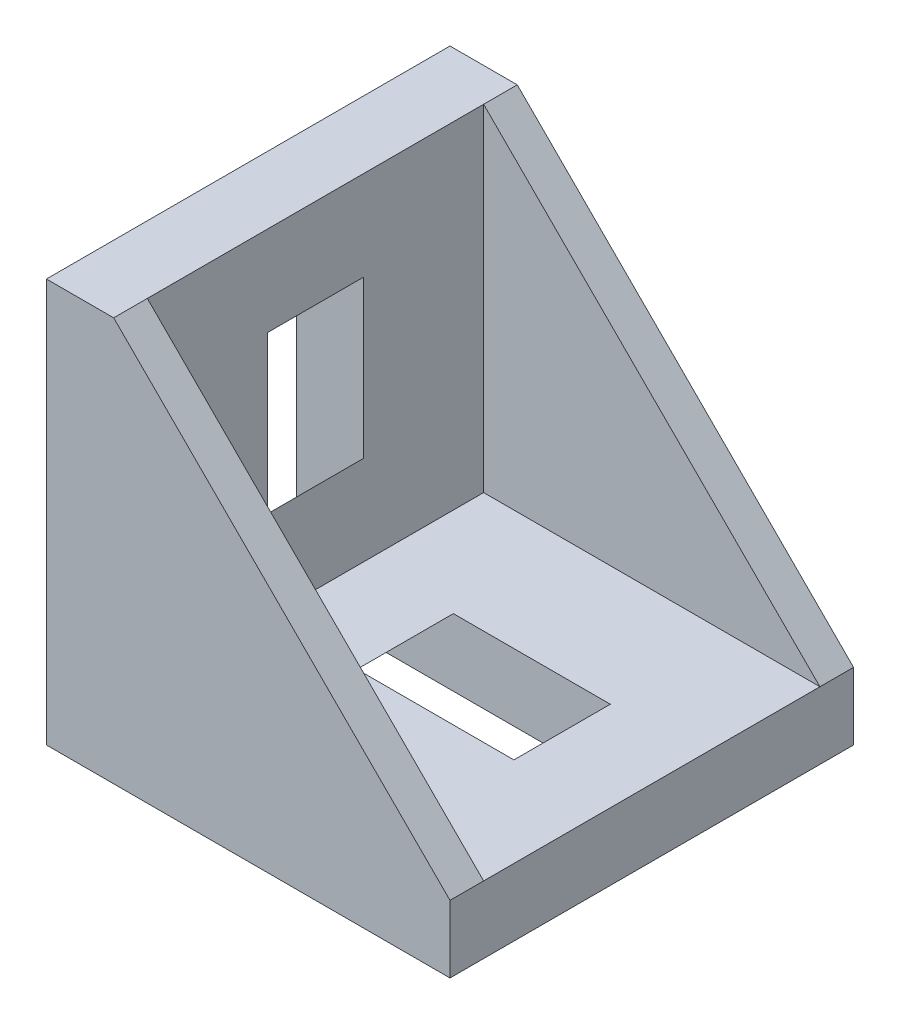
ISO-10303-21;
HEADER;
FILE_DESCRIPTION(('STEP AP214'),'2;1');
FILE_NAME('part.step','',(''),(''),'','','');
FILE_SCHEMA(('AUTOMOTIVE_DESIGN { 1 0 10303 214 1 1 1 1 }'));
ENDSEC;
DATA;
#1=APPLICATION_CONTEXT('core data for automotive mechanical design processes');
#2=APPLICATION_PROTOCOL_DEFINITION('international standard','automotive_design',2000,#1);
#3=PRODUCT_CONTEXT('',#1,'mechanical');
#4=PRODUCT('Part','Part','',(#3));
#5=PRODUCT_RELATED_PRODUCT_CATEGORY('part','',(#4));
#6=PRODUCT_DEFINITION_FORMATION('','',#4);
#7=PRODUCT_DEFINITION_CONTEXT('part definition',#1,'design');
#8=PRODUCT_DEFINITION('design','',#6,#7);
#9=PRODUCT_DEFINITION_SHAPE('','',#8);
#10=(LENGTH_UNIT() NAMED_UNIT(*) SI_UNIT(.MILLI.,.METRE.));
#11=(NAMED_UNIT(*) PLANE_ANGLE_UNIT() SI_UNIT($,.RADIAN.));
#12=(NAMED_UNIT(*) SI_UNIT($,.STERADIAN.) SOLID_ANGLE_UNIT());
#13=UNCERTAINTY_MEASURE_WITH_UNIT(LENGTH_MEASURE(1.E-05),#10,'distance_accuracy_value','');
#14=(GEOMETRIC_REPRESENTATION_CONTEXT(3) GLOBAL_UNCERTAINTY_ASSIGNED_CONTEXT((#13)) GLOBAL_UNIT_ASSIGNED_CONTEXT((#10,
#11,#12)) REPRESENTATION_CONTEXT('',''));
#15=CARTESIAN_POINT('',(0.,0.,0.));
#16=DIRECTION('',(0.,0.,1.));
#17=DIRECTION('',(1.,0.,0.));
#18=AXIS2_PLACEMENT_3D('',#15,#16,#17);
#19=CARTESIAN_POINT('',(0.,0.,9.));
#20=DIRECTION('',(1.,0.,0.));
#21=DIRECTION('',(0.,0.,-1.));
#22=AXIS2_PLACEMENT_3D('',#19,#20,#21);
#23=PLANE('',#22);
#24=DIRECTION('',(0.,0.,-1.));
#25=VECTOR('',#24,1.);
#26=CARTESIAN_POINT('',(0.,17.3,2.5));
#27=LINE('',#26,#25);
#28=CARTESIAN_POINT('',(0.,17.3,2.5));
#29=VERTEX_POINT('',#28);
#30=CARTESIAN_POINT('',(0.,17.3,-2.5));
#31=VERTEX_POINT('',#30);
#32=EDGE_CURVE('E290',#29,#31,#27,.T.);
#33=ORIENTED_EDGE('',*,*,#32,.F.);
#34=DIRECTION('',(0.,1.,0.));
#35=VECTOR('',#34,1.);
#36=CARTESIAN_POINT('',(0.,17.3,2.5));
#37=LINE('',#36,#35);
#38=CARTESIAN_POINT('',(0.,14.9992165715514,2.5));
#39=VERTEX_POINT('',#38);
#40=EDGE_CURVE('E287',#39,#29,#37,.T.);
#41=ORIENTED_EDGE('',*,*,#40,.F.);
#42=DIRECTION('',(0.,0.,-1.));
#43=VECTOR('',#42,1.);
#44=CARTESIAN_POINT('',(0.,14.9992165715514,2.5));
#45=LINE('',#44,#43);
#46=CARTESIAN_POINT('',(0.,14.9992165715514,-2.5));
#47=VERTEX_POINT('',#46);
#48=EDGE_CURVE('E301',#39,#47,#45,.T.);
#49=ORIENTED_EDGE('',*,*,#48,.T.);
#50=DIRECTION('',(0.,1.,0.));
#51=VECTOR('',#50,1.);
#52=CARTESIAN_POINT('',(0.,17.3,-2.5));
#53=LINE('',#52,#51);
#54=EDGE_CURVE('E282',#47,#31,#53,.T.);
#55=ORIENTED_EDGE('',*,*,#54,.T.);
#56=EDGE_LOOP('',(#33,#41,#49,#55));
#57=FACE_BOUND('',#56,.T.);
#58=DIRECTION('',(0.,-1.,0.));
#59=VECTOR('',#58,1.);
#60=CARTESIAN_POINT('',(0.,14.,-2.15));
#61=LINE('',#60,#59);
#62=CARTESIAN_POINT('',(0.,14.,-2.15));
#63=VERTEX_POINT('',#62);
#64=CARTESIAN_POINT('',(0.,4.,-2.15));
#65=VERTEX_POINT('',#64);
#66=EDGE_CURVE('E404',#63,#65,#61,.T.);
#67=ORIENTED_EDGE('',*,*,#66,.F.);
#68=DIRECTION('',(0.,0.,1.));
#69=VECTOR('',#68,1.);
#70=CARTESIAN_POINT('',(0.,14.,-2.15));
#71=LINE('',#70,#69);
#72=CARTESIAN_POINT('',(0.,14.,2.15));
#73=VERTEX_POINT('',#72);
#74=EDGE_CURVE('E427',#63,#73,#71,.T.);
#75=ORIENTED_EDGE('',*,*,#74,.T.);
#76=DIRECTION('',(0.,-1.,0.));
#77=VECTOR('',#76,1.);
#78=CARTESIAN_POINT('',(0.,14.,2.15));
#79=LINE('',#78,#77);
#80=CARTESIAN_POINT('',(0.,4.,2.15));
#81=VERTEX_POINT('',#80);
#82=EDGE_CURVE('E395',#73,#81,#79,.T.);
#83=ORIENTED_EDGE('',*,*,#82,.T.);
#84=DIRECTION('',(0.,0.,1.));
#85=VECTOR('',#84,1.);
#86=CARTESIAN_POINT('',(0.,4.,-2.15));
#87=LINE('',#86,#85);
#88=EDGE_CURVE('E416',#65,#81,#87,.T.);
#89=ORIENTED_EDGE('',*,*,#88,.F.);
#90=EDGE_LOOP('',(#67,#75,#83,#89));
#91=FACE_BOUND('',#90,.T.);
#92=DIRECTION('',(0.,-1.,0.));
#93=VECTOR('',#92,1.);
#94=CARTESIAN_POINT('',(0.,0.,-9.));
#95=LINE('',#94,#93);
#96=CARTESIAN_POINT('',(0.,18.,-9.));
#97=VERTEX_POINT('',#96);
#98=CARTESIAN_POINT('',(0.,0.,-9.));
#99=VERTEX_POINT('',#98);
#100=EDGE_CURVE('E467',#97,#99,#95,.T.);
#101=ORIENTED_EDGE('',*,*,#100,.T.);
#102=DIRECTION('',(0.,0.,-1.));
#103=VECTOR('',#102,1.);
#104=CARTESIAN_POINT('',(0.,0.,9.));
#105=LINE('',#104,#103);
#106=CARTESIAN_POINT('',(0.,0.,9.));
#107=VERTEX_POINT('',#106);
#108=EDGE_CURVE('E475',#107,#99,#105,.T.);
#109=ORIENTED_EDGE('',*,*,#108,.F.);
#110=DIRECTION('',(0.,-1.,0.));
#111=VECTOR('',#110,1.);
#112=CARTESIAN_POINT('',(0.,0.,9.));
#113=LINE('',#112,#111);
#114=CARTESIAN_POINT('',(0.,18.,9.));
#115=VERTEX_POINT('',#114);
#116=EDGE_CURVE('E473',#115,#107,#113,.T.);
#117=ORIENTED_EDGE('',*,*,#116,.F.);
#118=DIRECTION('',(0.,0.,-1.));
#119=VECTOR('',#118,1.);
#120=CARTESIAN_POINT('',(0.,18.,9.));
#121=LINE('',#120,#119);
#122=EDGE_CURVE('E489',#115,#97,#121,.T.);
#123=ORIENTED_EDGE('',*,*,#122,.T.);
#124=EDGE_LOOP('',(#101,#109,#117,#123));
#125=FACE_BOUND('',#124,.T.);
#126=DIRECTION('',(0.,1.,0.));
#127=VECTOR('',#126,1.);
#128=CARTESIAN_POINT('',(0.,1.23475047748417,2.5));
#129=LINE('',#128,#127);
#130=CARTESIAN_POINT('',(0.,1.23475047748417,2.5));
#131=VERTEX_POINT('',#130);
#132=CARTESIAN_POINT('',(0.,3.53553390593273,2.5));
#133=VERTEX_POINT('',#132);
#134=EDGE_CURVE('E310',#131,#133,#129,.T.);
#135=ORIENTED_EDGE('',*,*,#134,.F.);
#136=DIRECTION('',(0.,0.,-1.));
#137=VECTOR('',#136,1.);
#138=CARTESIAN_POINT('',(0.,1.23475047748417,2.5));
#139=LINE('',#138,#137);
#140=CARTESIAN_POINT('',(0.,1.23475047748417,-2.5));
#141=VERTEX_POINT('',#140);
#142=EDGE_CURVE('E320',#131,#141,#139,.T.);
#143=ORIENTED_EDGE('',*,*,#142,.T.);
#144=DIRECTION('',(0.,1.,0.));
#145=VECTOR('',#144,1.);
#146=CARTESIAN_POINT('',(0.,1.23475047748417,-2.5));
#147=LINE('',#146,#145);
#148=CARTESIAN_POINT('',(0.,3.53553390593273,-2.5));
#149=VERTEX_POINT('',#148);
#150=EDGE_CURVE('E309',#141,#149,#147,.T.);
#151=ORIENTED_EDGE('',*,*,#150,.T.);
#152=DIRECTION('',(0.,0.,-1.));
#153=VECTOR('',#152,1.);
#154=CARTESIAN_POINT('',(0.,3.53553390593273,2.5));
#155=LINE('',#154,#153);
#156=EDGE_CURVE('E336',#133,#149,#155,.T.);
#157=ORIENTED_EDGE('',*,*,#156,.F.);
#158=EDGE_LOOP('',(#135,#143,#151,#157));
#159=FACE_BOUND('',#158,.T.);
#160=ADVANCED_FACE('F34',(#57,#91,#125,#159),#23,.F.);
#161=CARTESIAN_POINT('',(18.,0.,9.));
#162=DIRECTION('',(0.,1.,0.));
#163=DIRECTION('',(-1.,0.,0.));
#164=AXIS2_PLACEMENT_3D('',#161,#162,#163);
#165=PLANE('',#164);
#166=DIRECTION('',(0.,0.,-1.));
#167=VECTOR('',#166,1.);
#168=CARTESIAN_POINT('',(14.9992165715514,0.,2.5));
#169=LINE('',#168,#167);
#170=CARTESIAN_POINT('',(14.9992165715514,0.,2.5));
#171=VERTEX_POINT('',#170);
#172=CARTESIAN_POINT('',(14.9992165715514,0.,-2.5));
#173=VERTEX_POINT('',#172);
#174=EDGE_CURVE('E49',#171,#173,#169,.T.);
#175=ORIENTED_EDGE('',*,*,#174,.F.);
#176=DIRECTION('',(-1.,0.,0.));
#177=VECTOR('',#176,1.);
#178=CARTESIAN_POINT('',(17.3,0.,2.5));
#179=LINE('',#178,#177);
#180=CARTESIAN_POINT('',(17.3,0.,2.5));
#181=VERTEX_POINT('',#180);
#182=EDGE_CURVE('E54',#181,#171,#179,.T.);
#183=ORIENTED_EDGE('',*,*,#182,.F.);
#184=DIRECTION('',(0.,0.,-1.));
#185=VECTOR('',#184,1.);
#186=CARTESIAN_POINT('',(17.3,0.,2.5));
#187=LINE('',#186,#185);
#188=CARTESIAN_POINT('',(17.3,0.,-2.5));
#189=VERTEX_POINT('',#188);
#190=EDGE_CURVE('E262',#181,#189,#187,.T.);
#191=ORIENTED_EDGE('',*,*,#190,.T.);
#192=DIRECTION('',(-1.,0.,0.));
#193=VECTOR('',#192,1.);
#194=CARTESIAN_POINT('',(17.3,0.,-2.5));
#195=LINE('',#194,#193);
#196=EDGE_CURVE('E266',#189,#173,#195,.T.);
#197=ORIENTED_EDGE('',*,*,#196,.T.);
#198=EDGE_LOOP('',(#175,#183,#191,#197));
#199=FACE_BOUND('',#198,.T.);
#200=DIRECTION('',(1.,0.,0.));
#201=VECTOR('',#200,1.);
#202=CARTESIAN_POINT('',(4.,0.,-2.15));
#203=LINE('',#202,#201);
#204=CARTESIAN_POINT('',(4.,0.,-2.15));
#205=VERTEX_POINT('',#204);
#206=CARTESIAN_POINT('',(14.,0.,-2.15));
#207=VERTEX_POINT('',#206);
#208=EDGE_CURVE('E372',#205,#207,#203,.T.);
#209=ORIENTED_EDGE('',*,*,#208,.F.);
#210=DIRECTION('',(0.,0.,1.));
#211=VECTOR('',#210,1.);
#212=CARTESIAN_POINT('',(4.,0.,-2.15));
#213=LINE('',#212,#211);
#214=CARTESIAN_POINT('',(4.,0.,2.15));
#215=VERTEX_POINT('',#214);
#216=EDGE_CURVE('E382',#205,#215,#213,.T.);
#217=ORIENTED_EDGE('',*,*,#216,.T.);
#218=DIRECTION('',(1.,0.,0.));
#219=VECTOR('',#218,1.);
#220=CARTESIAN_POINT('',(4.,0.,2.15));
#221=LINE('',#220,#219);
#222=CARTESIAN_POINT('',(14.,0.,2.15));
#223=VERTEX_POINT('',#222);
#224=EDGE_CURVE('E385',#215,#223,#221,.T.);
#225=ORIENTED_EDGE('',*,*,#224,.T.);
#226=DIRECTION('',(0.,0.,1.));
#227=VECTOR('',#226,1.);
#228=CARTESIAN_POINT('',(14.,0.,-2.15));
#229=LINE('',#228,#227);
#230=EDGE_CURVE('E399',#207,#223,#229,.T.);
#231=ORIENTED_EDGE('',*,*,#230,.F.);
#232=EDGE_LOOP('',(#209,#217,#225,#231));
#233=FACE_BOUND('',#232,.T.);
#234=DIRECTION('',(1.,0.,0.));
#235=VECTOR('',#234,1.);
#236=CARTESIAN_POINT('',(18.,0.,-9.));
#237=LINE('',#236,#235);
#238=CARTESIAN_POINT('',(18.,0.,-9.));
#239=VERTEX_POINT('',#238);
#240=EDGE_CURVE('E459',#99,#239,#237,.T.);
#241=ORIENTED_EDGE('',*,*,#240,.T.);
#242=DIRECTION('',(0.,0.,-1.));
#243=VECTOR('',#242,1.);
#244=CARTESIAN_POINT('',(18.,0.,9.));
#245=LINE('',#244,#243);
#246=CARTESIAN_POINT('',(18.,0.,9.));
#247=VERTEX_POINT('',#246);
#248=EDGE_CURVE('E11',#247,#239,#245,.T.);
#249=ORIENTED_EDGE('',*,*,#248,.F.);
#250=DIRECTION('',(1.,0.,0.));
#251=VECTOR('',#250,1.);
#252=CARTESIAN_POINT('',(18.,0.,9.));
#253=LINE('',#252,#251);
#254=EDGE_CURVE('E463',#107,#247,#253,.T.);
#255=ORIENTED_EDGE('',*,*,#254,.F.);
#256=ORIENTED_EDGE('',*,*,#108,.T.);
#257=EDGE_LOOP('',(#241,#249,#255,#256));
#258=FACE_BOUND('',#257,.T.);
#259=DIRECTION('',(-1.,0.,0.));
#260=VECTOR('',#259,1.);
#261=CARTESIAN_POINT('',(1.23475047748409,0.,2.5));
#262=LINE('',#261,#260);
#263=CARTESIAN_POINT('',(3.53553390593274,0.,2.5));
#264=VERTEX_POINT('',#263);
#265=CARTESIAN_POINT('',(1.23475047748409,0.,2.5));
#266=VERTEX_POINT('',#265);
#267=EDGE_CURVE('E341',#264,#266,#262,.T.);
#268=ORIENTED_EDGE('',*,*,#267,.F.);
#269=DIRECTION('',(0.,0.,-1.));
#270=VECTOR('',#269,1.);
#271=CARTESIAN_POINT('',(3.53553390593274,0.,2.5));
#272=LINE('',#271,#270);
#273=CARTESIAN_POINT('',(3.53553390593274,0.,-2.5));
#274=VERTEX_POINT('',#273);
#275=EDGE_CURVE('E365',#264,#274,#272,.T.);
#276=ORIENTED_EDGE('',*,*,#275,.T.);
#277=DIRECTION('',(-1.,0.,0.));
#278=VECTOR('',#277,1.);
#279=CARTESIAN_POINT('',(1.23475047748409,0.,-2.5));
#280=LINE('',#279,#278);
#281=CARTESIAN_POINT('',(1.23475047748409,0.,-2.5));
#282=VERTEX_POINT('',#281);
#283=EDGE_CURVE('E351',#274,#282,#280,.T.);
#284=ORIENTED_EDGE('',*,*,#283,.T.);
#285=DIRECTION('',(0.,0.,-1.));
#286=VECTOR('',#285,1.);
#287=CARTESIAN_POINT('',(1.23475047748409,0.,2.5));
#288=LINE('',#287,#286);
#289=EDGE_CURVE('E362',#266,#282,#288,.T.);
#290=ORIENTED_EDGE('',*,*,#289,.F.);
#291=EDGE_LOOP('',(#268,#276,#284,#290));
#292=FACE_BOUND('',#291,.T.);
#293=ADVANCED_FACE('F36',(#199,#233,#258,#292),#165,.F.);
#294=CARTESIAN_POINT('',(3.,3.,-7.5));
#295=DIRECTION('',(0.,-1.,0.));
#296=DIRECTION('',(0.,0.,-1.));
#297=AXIS2_PLACEMENT_3D('',#294,#295,#296);
#298=PLANE('',#297);
#299=DIRECTION('',(1.,0.,0.));
#300=VECTOR('',#299,1.);
#301=CARTESIAN_POINT('',(3.,3.,7.5));
#302=LINE('',#301,#300);
#303=CARTESIAN_POINT('',(3.,3.,7.5));
#304=VERTEX_POINT('',#303);
#305=CARTESIAN_POINT('',(18.,3.,7.5));
#306=VERTEX_POINT('',#305);
#307=EDGE_CURVE('E442',#304,#306,#302,.T.);
#308=ORIENTED_EDGE('',*,*,#307,.T.);
#309=DIRECTION('',(0.,0.,1.));
#310=VECTOR('',#309,1.);
#311=CARTESIAN_POINT('',(18.,3.,-7.5));
#312=LINE('',#311,#310);
#313=CARTESIAN_POINT('',(18.,3.,-7.5));
#314=VERTEX_POINT('',#313);
#315=EDGE_CURVE('E456',#314,#306,#312,.T.);
#316=ORIENTED_EDGE('',*,*,#315,.F.);
#317=DIRECTION('',(1.,0.,0.));
#318=VECTOR('',#317,1.);
#319=CARTESIAN_POINT('',(3.,3.,-7.5));
#320=LINE('',#319,#318);
#321=CARTESIAN_POINT('',(3.,3.,-7.5));
#322=VERTEX_POINT('',#321);
#323=EDGE_CURVE('E445',#322,#314,#320,.T.);
#324=ORIENTED_EDGE('',*,*,#323,.F.);
#325=DIRECTION('',(0.,0.,1.));
#326=VECTOR('',#325,1.);
#327=CARTESIAN_POINT('',(3.,3.,-7.5));
#328=LINE('',#327,#326);
#329=EDGE_CURVE('E460',#322,#304,#328,.T.);
#330=ORIENTED_EDGE('',*,*,#329,.T.);
#331=EDGE_LOOP('',(#308,#316,#324,#330));
#332=FACE_BOUND('',#331,.T.);
#333=DIRECTION('',(-1.,0.,0.));
#334=VECTOR('',#333,1.);
#335=CARTESIAN_POINT('',(7.,3.,-2.15));
#336=LINE('',#335,#334);
#337=CARTESIAN_POINT('',(14.,3.,-2.15));
#338=VERTEX_POINT('',#337);
#339=CARTESIAN_POINT('',(7.,3.,-2.15));
#340=VERTEX_POINT('',#339);
#341=EDGE_CURVE('E379',#338,#340,#336,.T.);
#342=ORIENTED_EDGE('',*,*,#341,.F.);
#343=DIRECTION('',(0.,0.,1.));
#344=VECTOR('',#343,1.);
#345=CARTESIAN_POINT('',(14.,3.,-2.15));
#346=LINE('',#345,#344);
#347=CARTESIAN_POINT('',(14.,3.,2.15));
#348=VERTEX_POINT('',#347);
#349=EDGE_CURVE('E396',#338,#348,#346,.T.);
#350=ORIENTED_EDGE('',*,*,#349,.T.);
#351=DIRECTION('',(-1.,0.,0.));
#352=VECTOR('',#351,1.);
#353=CARTESIAN_POINT('',(7.,3.,2.15));
#354=LINE('',#353,#352);
#355=CARTESIAN_POINT('',(7.,3.,2.15));
#356=VERTEX_POINT('',#355);
#357=EDGE_CURVE('E373',#348,#356,#354,.T.);
#358=ORIENTED_EDGE('',*,*,#357,.T.);
#359=DIRECTION('',(0.,0.,1.));
#360=VECTOR('',#359,1.);
#361=CARTESIAN_POINT('',(7.,3.,-2.15));
#362=LINE('',#361,#360);
#363=EDGE_CURVE('E392',#340,#356,#362,.T.);
#364=ORIENTED_EDGE('',*,*,#363,.F.);
#365=EDGE_LOOP('',(#342,#350,#358,#364));
#366=FACE_BOUND('',#365,.T.);
#367=ADVANCED_FACE('F533',(#332,#366),#298,.F.);
#368=CARTESIAN_POINT('',(3.,18.,-7.5));
#369=DIRECTION('',(-1.,0.,0.));
#370=DIRECTION('',(0.,-1.,0.));
#371=AXIS2_PLACEMENT_3D('',#368,#369,#370);
#372=PLANE('',#371);
#373=DIRECTION('',(0.,-1.,0.));
#374=VECTOR('',#373,1.);
#375=CARTESIAN_POINT('',(3.,18.,7.5));
#376=LINE('',#375,#374);
#377=CARTESIAN_POINT('',(3.,18.,7.5));
#378=VERTEX_POINT('',#377);
#379=EDGE_CURVE('E451',#378,#304,#376,.T.);
#380=ORIENTED_EDGE('',*,*,#379,.T.);
#381=ORIENTED_EDGE('',*,*,#329,.F.);
#382=DIRECTION('',(0.,-1.,0.));
#383=VECTOR('',#382,1.);
#384=CARTESIAN_POINT('',(3.,18.,-7.5));
#385=LINE('',#384,#383);
#386=CARTESIAN_POINT('',(3.,18.,-7.5));
#387=VERTEX_POINT('',#386);
#388=EDGE_CURVE('E441',#387,#322,#385,.T.);
#389=ORIENTED_EDGE('',*,*,#388,.F.);
#390=DIRECTION('',(0.,0.,1.));
#391=VECTOR('',#390,1.);
#392=CARTESIAN_POINT('',(3.,18.,-7.5));
#393=LINE('',#392,#391);
#394=EDGE_CURVE('E448',#387,#378,#393,.T.);
#395=ORIENTED_EDGE('',*,*,#394,.T.);
#396=EDGE_LOOP('',(#380,#381,#389,#395));
#397=FACE_BOUND('',#396,.T.);
#398=DIRECTION('',(0.,1.,0.));
#399=VECTOR('',#398,1.);
#400=CARTESIAN_POINT('',(3.,14.,-2.15));
#401=LINE('',#400,#399);
#402=CARTESIAN_POINT('',(3.,7.,-2.15));
#403=VERTEX_POINT('',#402);
#404=CARTESIAN_POINT('',(3.,14.,-2.15));
#405=VERTEX_POINT('',#404);
#406=EDGE_CURVE('E411',#403,#405,#401,.T.);
#407=ORIENTED_EDGE('',*,*,#406,.F.);
#408=DIRECTION('',(0.,0.,1.));
#409=VECTOR('',#408,1.);
#410=CARTESIAN_POINT('',(3.,7.,-2.15));
#411=LINE('',#410,#409);
#412=CARTESIAN_POINT('',(3.,7.,2.15));
#413=VERTEX_POINT('',#412);
#414=EDGE_CURVE('E434',#403,#413,#411,.T.);
#415=ORIENTED_EDGE('',*,*,#414,.T.);
#416=DIRECTION('',(0.,1.,0.));
#417=VECTOR('',#416,1.);
#418=CARTESIAN_POINT('',(3.,14.,2.15));
#419=LINE('',#418,#417);
#420=CARTESIAN_POINT('',(3.,14.,2.15));
#421=VERTEX_POINT('',#420);
#422=EDGE_CURVE('E422',#413,#421,#419,.T.);
#423=ORIENTED_EDGE('',*,*,#422,.T.);
#424=DIRECTION('',(0.,0.,1.));
#425=VECTOR('',#424,1.);
#426=CARTESIAN_POINT('',(3.,14.,-2.15));
#427=LINE('',#426,#425);
#428=EDGE_CURVE('E431',#405,#421,#427,.T.);
#429=ORIENTED_EDGE('',*,*,#428,.F.);
#430=EDGE_LOOP('',(#407,#415,#423,#429));
#431=FACE_BOUND('',#430,.T.);
#432=ADVANCED_FACE('F538',(#397,#431),#372,.F.);
#433=CARTESIAN_POINT('',(18.,3.,9.));
#434=DIRECTION('',(-0.707106781186547,-0.707106781186547,0.));
#435=DIRECTION('',(0.707106781186548,-0.707106781186548,0.));
#436=AXIS2_PLACEMENT_3D('',#433,#434,#435);
#437=PLANE('',#436);
#438=DIRECTION('',(-0.707106781186547,0.707106781186547,0.));
#439=VECTOR('',#438,1.);
#440=CARTESIAN_POINT('',(3.,18.,-7.5));
#441=LINE('',#440,#439);
#442=EDGE_CURVE('E439',#314,#387,#441,.T.);
#443=ORIENTED_EDGE('',*,*,#442,.F.);
#444=DIRECTION('',(0.,0.,-1.));
#445=VECTOR('',#444,1.);
#446=CARTESIAN_POINT('',(18.,3.,9.));
#447=LINE('',#446,#445);
#448=CARTESIAN_POINT('',(18.,3.,-9.));
#449=VERTEX_POINT('',#448);
#450=EDGE_CURVE('E495',#314,#449,#447,.T.);
#451=ORIENTED_EDGE('',*,*,#450,.T.);
#452=DIRECTION('',(-0.707106781186547,0.707106781186547,0.));
#453=VECTOR('',#452,1.);
#454=CARTESIAN_POINT('',(18.,3.,-9.));
#455=LINE('',#454,#453);
#456=CARTESIAN_POINT('',(3.,18.,-9.));
#457=VERTEX_POINT('',#456);
#458=EDGE_CURVE('E481',#449,#457,#455,.T.);
#459=ORIENTED_EDGE('',*,*,#458,.T.);
#460=DIRECTION('',(0.,0.,-1.));
#461=VECTOR('',#460,1.);
#462=CARTESIAN_POINT('',(3.,18.,9.));
#463=LINE('',#462,#461);
#464=EDGE_CURVE('E492',#387,#457,#463,.T.);
#465=ORIENTED_EDGE('',*,*,#464,.F.);
#466=EDGE_LOOP('',(#443,#451,#459,#465));
#467=FACE_BOUND('',#466,.T.);
#468=ADVANCED_FACE('F503',(#467),#437,.F.);
#469=CARTESIAN_POINT('',(18.,3.,9.));
#470=DIRECTION('',(-1.,0.,0.));
#471=DIRECTION('',(0.,0.,1.));
#472=AXIS2_PLACEMENT_3D('',#469,#470,#471);
#473=PLANE('',#472);
#474=DIRECTION('',(0.,1.,0.));
#475=VECTOR('',#474,1.);
#476=CARTESIAN_POINT('',(18.,3.,-9.));
#477=LINE('',#476,#475);
#478=EDGE_CURVE('E478',#239,#449,#477,.T.);
#479=ORIENTED_EDGE('',*,*,#478,.T.);
#480=ORIENTED_EDGE('',*,*,#450,.F.);
#481=ORIENTED_EDGE('',*,*,#315,.T.);
#482=CARTESIAN_POINT('',(18.,3.,9.));
#483=VERTEX_POINT('',#482);
#484=EDGE_CURVE('E42',#483,#306,#447,.T.);
#485=ORIENTED_EDGE('',*,*,#484,.F.);
#486=DIRECTION('',(0.,1.,0.));
#487=VECTOR('',#486,1.);
#488=CARTESIAN_POINT('',(18.,3.,9.));
#489=LINE('',#488,#487);
#490=EDGE_CURVE('E466',#247,#483,#489,.T.);
#491=ORIENTED_EDGE('',*,*,#490,.F.);
#492=ORIENTED_EDGE('',*,*,#248,.T.);
#493=EDGE_LOOP('',(#479,#480,#481,#485,#491,#492));
#494=FACE_BOUND('',#493,.T.);
#495=ADVANCED_FACE('F508',(#494),#473,.F.);
#496=ORIENTED_EDGE('',*,*,#484,.T.);
#497=DIRECTION('',(-0.707106781186547,0.707106781186547,0.));
#498=VECTOR('',#497,1.);
#499=CARTESIAN_POINT('',(3.,18.,7.5));
#500=LINE('',#499,#498);
#501=EDGE_CURVE('E430',#306,#378,#500,.T.);
#502=ORIENTED_EDGE('',*,*,#501,.T.);
#503=CARTESIAN_POINT('',(3.,18.,9.));
#504=VERTEX_POINT('',#503);
#505=EDGE_CURVE('E493',#504,#378,#463,.T.);
#506=ORIENTED_EDGE('',*,*,#505,.F.);
#507=DIRECTION('',(-0.707106781186547,0.707106781186547,0.));
#508=VECTOR('',#507,1.);
#509=CARTESIAN_POINT('',(18.,3.,9.));
#510=LINE('',#509,#508);
#511=EDGE_CURVE('E469',#483,#504,#510,.T.);
#512=ORIENTED_EDGE('',*,*,#511,.F.);
#513=EDGE_LOOP('',(#496,#502,#506,#512));
#514=FACE_BOUND('',#513,.T.);
#515=ADVANCED_FACE('F527',(#514),#437,.F.);
#516=CARTESIAN_POINT('',(3.,18.,9.));
#517=DIRECTION('',(0.,-1.,0.));
#518=DIRECTION('',(0.,0.,-1.));
#519=AXIS2_PLACEMENT_3D('',#516,#517,#518);
#520=PLANE('',#519);
#521=DIRECTION('',(-1.,0.,0.));
#522=VECTOR('',#521,1.);
#523=CARTESIAN_POINT('',(3.,18.,-9.));
#524=LINE('',#523,#522);
#525=EDGE_CURVE('E484',#457,#97,#524,.T.);
#526=ORIENTED_EDGE('',*,*,#525,.T.);
#527=ORIENTED_EDGE('',*,*,#122,.F.);
#528=DIRECTION('',(-1.,0.,0.));
#529=VECTOR('',#528,1.);
#530=CARTESIAN_POINT('',(3.,18.,9.));
#531=LINE('',#530,#529);
#532=EDGE_CURVE('E471',#504,#115,#531,.T.);
#533=ORIENTED_EDGE('',*,*,#532,.F.);
#534=ORIENTED_EDGE('',*,*,#505,.T.);
#535=ORIENTED_EDGE('',*,*,#394,.F.);
#536=ORIENTED_EDGE('',*,*,#464,.T.);
#537=EDGE_LOOP('',(#526,#527,#533,#534,#535,#536));
#538=FACE_BOUND('',#537,.T.);
#539=ADVANCED_FACE('F516',(#538),#520,.F.);
#540=CARTESIAN_POINT('',(0.,0.,9.));
#541=DIRECTION('',(0.,0.,-1.));
#542=DIRECTION('',(-1.,0.,0.));
#543=AXIS2_PLACEMENT_3D('',#540,#541,#542);
#544=PLANE('',#543);
#545=ORIENTED_EDGE('',*,*,#254,.T.);
#546=ORIENTED_EDGE('',*,*,#490,.T.);
#547=ORIENTED_EDGE('',*,*,#511,.T.);
#548=ORIENTED_EDGE('',*,*,#532,.T.);
#549=ORIENTED_EDGE('',*,*,#116,.T.);
#550=EDGE_LOOP('',(#545,#546,#547,#548,#549));
#551=FACE_BOUND('',#550,.T.);
#552=ADVANCED_FACE('F525',(#551),#544,.F.);
#553=CARTESIAN_POINT('',(0.,0.,-9.));
#554=DIRECTION('',(0.,0.,-1.));
#555=DIRECTION('',(-1.,0.,0.));
#556=AXIS2_PLACEMENT_3D('',#553,#554,#555);
#557=PLANE('',#556);
#558=ORIENTED_EDGE('',*,*,#240,.F.);
#559=ORIENTED_EDGE('',*,*,#100,.F.);
#560=ORIENTED_EDGE('',*,*,#525,.F.);
#561=ORIENTED_EDGE('',*,*,#458,.F.);
#562=ORIENTED_EDGE('',*,*,#478,.F.);
#563=EDGE_LOOP('',(#558,#559,#560,#561,#562));
#564=FACE_BOUND('',#563,.T.);
#565=ADVANCED_FACE('F512',(#564),#557,.T.);
#566=CARTESIAN_POINT('',(18.,3.,-7.5));
#567=DIRECTION('',(0.,0.,1.));
#568=DIRECTION('',(1.,0.,0.));
#569=AXIS2_PLACEMENT_3D('',#566,#567,#568);
#570=PLANE('',#569);
#571=ORIENTED_EDGE('',*,*,#442,.T.);
#572=ORIENTED_EDGE('',*,*,#388,.T.);
#573=ORIENTED_EDGE('',*,*,#323,.T.);
#574=EDGE_LOOP('',(#571,#572,#573));
#575=FACE_BOUND('',#574,.T.);
#576=ADVANCED_FACE('F541',(#575),#570,.T.);
#577=CARTESIAN_POINT('',(18.,3.,7.5));
#578=DIRECTION('',(0.,0.,1.));
#579=DIRECTION('',(1.,0.,0.));
#580=AXIS2_PLACEMENT_3D('',#577,#578,#579);
#581=PLANE('',#580);
#582=ORIENTED_EDGE('',*,*,#501,.F.);
#583=ORIENTED_EDGE('',*,*,#307,.F.);
#584=ORIENTED_EDGE('',*,*,#379,.F.);
#585=EDGE_LOOP('',(#582,#583,#584));
#586=FACE_BOUND('',#585,.T.);
#587=ADVANCED_FACE('F531',(#586),#581,.F.);
#588=CARTESIAN_POINT('',(0.,14.,-2.15));
#589=DIRECTION('',(0.,1.,0.));
#590=DIRECTION('',(0.,0.,1.));
#591=AXIS2_PLACEMENT_3D('',#588,#589,#590);
#592=PLANE('',#591);
#593=DIRECTION('',(-1.,0.,0.));
#594=VECTOR('',#593,1.);
#595=CARTESIAN_POINT('',(0.,14.,2.15));
#596=LINE('',#595,#594);
#597=EDGE_CURVE('E408',#421,#73,#596,.T.);
#598=ORIENTED_EDGE('',*,*,#597,.T.);
#599=ORIENTED_EDGE('',*,*,#74,.F.);
#600=DIRECTION('',(-1.,0.,0.));
#601=VECTOR('',#600,1.);
#602=CARTESIAN_POINT('',(0.,14.,-2.15));
#603=LINE('',#602,#601);
#604=EDGE_CURVE('E413',#405,#63,#603,.T.);
#605=ORIENTED_EDGE('',*,*,#604,.F.);
#606=ORIENTED_EDGE('',*,*,#428,.T.);
#607=EDGE_LOOP('',(#598,#599,#605,#606));
#608=FACE_BOUND('',#607,.T.);
#609=ADVANCED_FACE('F548',(#608),#592,.F.);
#610=CARTESIAN_POINT('',(0.,4.,-2.15));
#611=DIRECTION('',(0.707106781186548,-0.707106781186547,0.));
#612=DIRECTION('',(0.707106781186547,0.707106781186548,0.));
#613=AXIS2_PLACEMENT_3D('',#610,#611,#612);
#614=PLANE('',#613);
#615=DIRECTION('',(0.707106781186547,0.707106781186548,0.));
#616=VECTOR('',#615,1.);
#617=CARTESIAN_POINT('',(0.,4.,2.15));
#618=LINE('',#617,#616);
#619=EDGE_CURVE('E419',#81,#413,#618,.T.);
#620=ORIENTED_EDGE('',*,*,#619,.T.);
#621=ORIENTED_EDGE('',*,*,#414,.F.);
#622=DIRECTION('',(0.707106781186547,0.707106781186548,0.));
#623=VECTOR('',#622,1.);
#624=CARTESIAN_POINT('',(0.,4.,-2.15));
#625=LINE('',#624,#623);
#626=EDGE_CURVE('E407',#65,#403,#625,.T.);
#627=ORIENTED_EDGE('',*,*,#626,.F.);
#628=ORIENTED_EDGE('',*,*,#88,.T.);
#629=EDGE_LOOP('',(#620,#621,#627,#628));
#630=FACE_BOUND('',#629,.T.);
#631=ADVANCED_FACE('F632',(#630),#614,.F.);
#632=CARTESIAN_POINT('',(0.,14.,-2.15));
#633=DIRECTION('',(0.,0.,1.));
#634=DIRECTION('',(1.,0.,0.));
#635=AXIS2_PLACEMENT_3D('',#632,#633,#634);
#636=PLANE('',#635);
#637=ORIENTED_EDGE('',*,*,#66,.T.);
#638=ORIENTED_EDGE('',*,*,#626,.T.);
#639=ORIENTED_EDGE('',*,*,#406,.T.);
#640=ORIENTED_EDGE('',*,*,#604,.T.);
#641=EDGE_LOOP('',(#637,#638,#639,#640));
#642=FACE_BOUND('',#641,.T.);
#643=ADVANCED_FACE('F642',(#642),#636,.T.);
#644=CARTESIAN_POINT('',(0.,14.,2.15));
#645=DIRECTION('',(0.,0.,1.));
#646=DIRECTION('',(1.,0.,0.));
#647=AXIS2_PLACEMENT_3D('',#644,#645,#646);
#648=PLANE('',#647);
#649=ORIENTED_EDGE('',*,*,#82,.F.);
#650=ORIENTED_EDGE('',*,*,#597,.F.);
#651=ORIENTED_EDGE('',*,*,#422,.F.);
#652=ORIENTED_EDGE('',*,*,#619,.F.);
#653=EDGE_LOOP('',(#649,#650,#651,#652));
#654=FACE_BOUND('',#653,.T.);
#655=ADVANCED_FACE('F651',(#654),#648,.F.);
#656=CARTESIAN_POINT('',(7.,3.,-2.15));
#657=DIRECTION('',(-0.707106781186548,0.707106781186547,0.));
#658=DIRECTION('',(-0.707106781186547,-0.707106781186548,0.));
#659=AXIS2_PLACEMENT_3D('',#656,#657,#658);
#660=PLANE('',#659);
#661=DIRECTION('',(-0.707106781186547,-0.707106781186548,0.));
#662=VECTOR('',#661,1.);
#663=CARTESIAN_POINT('',(7.,3.,2.15));
#664=LINE('',#663,#662);
#665=EDGE_CURVE('E368',#356,#215,#664,.T.);
#666=ORIENTED_EDGE('',*,*,#665,.T.);
#667=ORIENTED_EDGE('',*,*,#216,.F.);
#668=DIRECTION('',(-0.707106781186547,-0.707106781186548,0.));
#669=VECTOR('',#668,1.);
#670=CARTESIAN_POINT('',(7.,3.,-2.15));
#671=LINE('',#670,#669);
#672=EDGE_CURVE('E369',#340,#205,#671,.T.);
#673=ORIENTED_EDGE('',*,*,#672,.F.);
#674=ORIENTED_EDGE('',*,*,#363,.T.);
#675=EDGE_LOOP('',(#666,#667,#673,#674));
#676=FACE_BOUND('',#675,.T.);
#677=ADVANCED_FACE('F661',(#676),#660,.F.);
#678=CARTESIAN_POINT('',(14.,3.,-2.15));
#679=DIRECTION('',(1.,0.,0.));
#680=DIRECTION('',(0.,0.,-1.));
#681=AXIS2_PLACEMENT_3D('',#678,#679,#680);
#682=PLANE('',#681);
#683=DIRECTION('',(0.,1.,0.));
#684=VECTOR('',#683,1.);
#685=CARTESIAN_POINT('',(14.,3.,2.15));
#686=LINE('',#685,#684);
#687=EDGE_CURVE('E388',#223,#348,#686,.T.);
#688=ORIENTED_EDGE('',*,*,#687,.T.);
#689=ORIENTED_EDGE('',*,*,#349,.F.);
#690=DIRECTION('',(0.,1.,0.));
#691=VECTOR('',#690,1.);
#692=CARTESIAN_POINT('',(14.,3.,-2.15));
#693=LINE('',#692,#691);
#694=EDGE_CURVE('E376',#207,#338,#693,.T.);
#695=ORIENTED_EDGE('',*,*,#694,.F.);
#696=ORIENTED_EDGE('',*,*,#230,.T.);
#697=EDGE_LOOP('',(#688,#689,#695,#696));
#698=FACE_BOUND('',#697,.T.);
#699=ADVANCED_FACE('F671',(#698),#682,.F.);
#700=CARTESIAN_POINT('',(4.,0.,-2.15));
#701=DIRECTION('',(0.,0.,1.));
#702=DIRECTION('',(1.,0.,0.));
#703=AXIS2_PLACEMENT_3D('',#700,#701,#702);
#704=PLANE('',#703);
#705=ORIENTED_EDGE('',*,*,#672,.T.);
#706=ORIENTED_EDGE('',*,*,#208,.T.);
#707=ORIENTED_EDGE('',*,*,#694,.T.);
#708=ORIENTED_EDGE('',*,*,#341,.T.);
#709=EDGE_LOOP('',(#705,#706,#707,#708));
#710=FACE_BOUND('',#709,.T.);
#711=ADVANCED_FACE('F681',(#710),#704,.T.);
#712=CARTESIAN_POINT('',(4.,0.,2.15));
#713=DIRECTION('',(0.,0.,1.));
#714=DIRECTION('',(1.,0.,0.));
#715=AXIS2_PLACEMENT_3D('',#712,#713,#714);
#716=PLANE('',#715);
#717=ORIENTED_EDGE('',*,*,#665,.F.);
#718=ORIENTED_EDGE('',*,*,#357,.F.);
#719=ORIENTED_EDGE('',*,*,#687,.F.);
#720=ORIENTED_EDGE('',*,*,#224,.F.);
#721=EDGE_LOOP('',(#717,#718,#719,#720));
#722=FACE_BOUND('',#721,.T.);
#723=ADVANCED_FACE('F691',(#722),#716,.F.);
#724=CARTESIAN_POINT('',(3.53553390593274,0.,2.5));
#725=DIRECTION('',(-0.663272861612076,0.748377652692094,0.));
#726=DIRECTION('',(-0.748377652692093,-0.663272861612076,0.));
#727=AXIS2_PLACEMENT_3D('',#724,#725,#726);
#728=PLANE('',#727);
#729=DIRECTION('',(0.748377652692093,0.663272861612076,0.));
#730=VECTOR('',#729,1.);
#731=CARTESIAN_POINT('',(3.53553390593274,0.,-2.5));
#732=LINE('',#731,#730);
#733=CARTESIAN_POINT('',(1.50457522691833,-1.8,-2.5));
#734=VERTEX_POINT('',#733);
#735=EDGE_CURVE('E338',#734,#274,#732,.T.);
#736=ORIENTED_EDGE('',*,*,#735,.T.);
#737=ORIENTED_EDGE('',*,*,#275,.F.);
#738=DIRECTION('',(0.748377652692093,0.663272861612076,0.));
#739=VECTOR('',#738,1.);
#740=CARTESIAN_POINT('',(3.53553390593274,0.,2.5));
#741=LINE('',#740,#739);
#742=CARTESIAN_POINT('',(1.50457522691833,-1.8,2.5));
#743=VERTEX_POINT('',#742);
#744=EDGE_CURVE('E339',#743,#264,#741,.T.);
#745=ORIENTED_EDGE('',*,*,#744,.F.);
#746=DIRECTION('',(0.,0.,-1.));
#747=VECTOR('',#746,1.);
#748=CARTESIAN_POINT('',(1.50457522691833,-1.8,2.5));
#749=LINE('',#748,#747);
#750=EDGE_CURVE('E348',#743,#734,#749,.T.);
#751=ORIENTED_EDGE('',*,*,#750,.T.);
#752=EDGE_LOOP('',(#736,#737,#745,#751));
#753=FACE_BOUND('',#752,.T.);
#754=ADVANCED_FACE('F700',(#753),#728,.F.);
#755=CARTESIAN_POINT('',(0.511249685150937,-0.790946088307917,2.5));
#756=DIRECTION('',(0.737866149456581,-0.674947068655105,0.));
#757=DIRECTION('',(0.674947068655105,0.737866149456581,0.));
#758=AXIS2_PLACEMENT_3D('',#755,#756,#757);
#759=PLANE('',#758);
#760=DIRECTION('',(-0.674947068655105,-0.737866149456581,0.));
#761=VECTOR('',#760,1.);
#762=CARTESIAN_POINT('',(0.511249685150937,-0.790946088307917,-2.5));
#763=LINE('',#762,#761);
#764=CARTESIAN_POINT('',(0.511249685150937,-0.790946088307917,-2.5));
#765=VERTEX_POINT('',#764);
#766=EDGE_CURVE('E354',#282,#765,#763,.T.);
#767=ORIENTED_EDGE('',*,*,#766,.T.);
#768=DIRECTION('',(0.,0.,-1.));
#769=VECTOR('',#768,1.);
#770=CARTESIAN_POINT('',(0.511249685150937,-0.790946088307917,2.5));
#771=LINE('',#770,#769);
#772=CARTESIAN_POINT('',(0.511249685150937,-0.790946088307917,2.5));
#773=VERTEX_POINT('',#772);
#774=EDGE_CURVE('E359',#773,#765,#771,.T.);
#775=ORIENTED_EDGE('',*,*,#774,.F.);
#776=DIRECTION('',(-0.674947068655105,-0.737866149456581,0.));
#777=VECTOR('',#776,1.);
#778=CARTESIAN_POINT('',(0.511249685150937,-0.790946088307917,2.5));
#779=LINE('',#778,#777);
#780=EDGE_CURVE('E344',#266,#773,#779,.T.);
#781=ORIENTED_EDGE('',*,*,#780,.F.);
#782=ORIENTED_EDGE('',*,*,#289,.T.);
#783=EDGE_LOOP('',(#767,#775,#781,#782));
#784=FACE_BOUND('',#783,.T.);
#785=ADVANCED_FACE('F721',(#784),#759,.F.);
#786=CARTESIAN_POINT('',(1.50457522691833,-1.8,2.5));
#787=DIRECTION('',(0.71263900766616,0.701530929291496,0.));
#788=DIRECTION('',(-0.701530929291496,0.71263900766616,0.));
#789=AXIS2_PLACEMENT_3D('',#786,#787,#788);
#790=PLANE('',#789);
#791=DIRECTION('',(0.701530929291496,-0.71263900766616,0.));
#792=VECTOR('',#791,1.);
#793=CARTESIAN_POINT('',(1.50457522691833,-1.8,-2.5));
#794=LINE('',#793,#792);
#795=EDGE_CURVE('E342',#765,#734,#794,.T.);
#796=ORIENTED_EDGE('',*,*,#795,.T.);
#797=ORIENTED_EDGE('',*,*,#750,.F.);
#798=DIRECTION('',(0.701530929291496,-0.71263900766616,0.));
#799=VECTOR('',#798,1.);
#800=CARTESIAN_POINT('',(1.50457522691833,-1.8,2.5));
#801=LINE('',#800,#799);
#802=EDGE_CURVE('E346',#773,#743,#801,.T.);
#803=ORIENTED_EDGE('',*,*,#802,.F.);
#804=ORIENTED_EDGE('',*,*,#774,.T.);
#805=EDGE_LOOP('',(#796,#797,#803,#804));
#806=FACE_BOUND('',#805,.T.);
#807=ADVANCED_FACE('F731',(#806),#790,.F.);
#808=CARTESIAN_POINT('',(1.50457522691833,-1.8,2.5));
#809=DIRECTION('',(0.,0.,-1.));
#810=DIRECTION('',(-1.,0.,0.));
#811=AXIS2_PLACEMENT_3D('',#808,#809,#810);
#812=PLANE('',#811);
#813=ORIENTED_EDGE('',*,*,#744,.T.);
#814=ORIENTED_EDGE('',*,*,#267,.T.);
#815=ORIENTED_EDGE('',*,*,#780,.T.);
#816=ORIENTED_EDGE('',*,*,#802,.T.);
#817=EDGE_LOOP('',(#813,#814,#815,#816));
#818=FACE_BOUND('',#817,.T.);
#819=ADVANCED_FACE('F741',(#818),#812,.F.);
#820=CARTESIAN_POINT('',(1.50457522691833,-1.8,-2.5));
#821=DIRECTION('',(0.,0.,-1.));
#822=DIRECTION('',(-1.,0.,0.));
#823=AXIS2_PLACEMENT_3D('',#820,#821,#822);
#824=PLANE('',#823);
#825=ORIENTED_EDGE('',*,*,#735,.F.);
#826=ORIENTED_EDGE('',*,*,#795,.F.);
#827=ORIENTED_EDGE('',*,*,#766,.F.);
#828=ORIENTED_EDGE('',*,*,#283,.F.);
#829=EDGE_LOOP('',(#825,#826,#827,#828));
#830=FACE_BOUND('',#829,.T.);
#831=ADVANCED_FACE('F751',(#830),#824,.T.);
#832=CARTESIAN_POINT('',(0.,3.53553390593273,2.5));
#833=DIRECTION('',(0.748377652692093,-0.663272861612077,0.));
#834=DIRECTION('',(0.663272861612077,0.748377652692093,0.));
#835=AXIS2_PLACEMENT_3D('',#832,#833,#834);
#836=PLANE('',#835);
#837=DIRECTION('',(-0.663272861612077,-0.748377652692093,0.));
#838=VECTOR('',#837,1.);
#839=CARTESIAN_POINT('',(0.,3.53553390593273,-2.5));
#840=LINE('',#839,#838);
#841=CARTESIAN_POINT('',(-1.8,1.50457522691833,-2.5));
#842=VERTEX_POINT('',#841);
#843=EDGE_CURVE('E323',#149,#842,#840,.T.);
#844=ORIENTED_EDGE('',*,*,#843,.T.);
#845=DIRECTION('',(0.,0.,-1.));
#846=VECTOR('',#845,1.);
#847=CARTESIAN_POINT('',(-1.8,1.50457522691833,2.5));
#848=LINE('',#847,#846);
#849=CARTESIAN_POINT('',(-1.8,1.50457522691833,2.5));
#850=VERTEX_POINT('',#849);
#851=EDGE_CURVE('E333',#850,#842,#848,.T.);
#852=ORIENTED_EDGE('',*,*,#851,.F.);
#853=DIRECTION('',(-0.663272861612077,-0.748377652692093,0.));
#854=VECTOR('',#853,1.);
#855=CARTESIAN_POINT('',(0.,3.53553390593273,2.5));
#856=LINE('',#855,#854);
#857=EDGE_CURVE('E313',#133,#850,#856,.T.);
#858=ORIENTED_EDGE('',*,*,#857,.F.);
#859=ORIENTED_EDGE('',*,*,#156,.T.);
#860=EDGE_LOOP('',(#844,#852,#858,#859));
#861=FACE_BOUND('',#860,.T.);
#862=ADVANCED_FACE('F761',(#861),#836,.F.);
#863=CARTESIAN_POINT('',(-1.8,1.50457522691833,2.5));
#864=DIRECTION('',(0.701530929291496,0.71263900766616,0.));
#865=DIRECTION('',(-0.71263900766616,0.701530929291496,0.));
#866=AXIS2_PLACEMENT_3D('',#863,#864,#865);
#867=PLANE('',#866);
#868=DIRECTION('',(0.71263900766616,-0.701530929291496,0.));
#869=VECTOR('',#868,1.);
#870=CARTESIAN_POINT('',(-1.8,1.50457522691833,-2.5));
#871=LINE('',#870,#869);
#872=CARTESIAN_POINT('',(-0.790946088307916,0.511249685150936,-2.5));
#873=VERTEX_POINT('',#872);
#874=EDGE_CURVE('E325',#842,#873,#871,.T.);
#875=ORIENTED_EDGE('',*,*,#874,.T.);
#876=DIRECTION('',(0.,0.,-1.));
#877=VECTOR('',#876,1.);
#878=CARTESIAN_POINT('',(-0.790946088307916,0.511249685150936,2.5));
#879=LINE('',#878,#877);
#880=CARTESIAN_POINT('',(-0.790946088307916,0.511249685150936,2.5));
#881=VERTEX_POINT('',#880);
#882=EDGE_CURVE('E330',#881,#873,#879,.T.);
#883=ORIENTED_EDGE('',*,*,#882,.F.);
#884=DIRECTION('',(0.71263900766616,-0.701530929291496,0.));
#885=VECTOR('',#884,1.);
#886=CARTESIAN_POINT('',(-1.8,1.50457522691833,2.5));
#887=LINE('',#886,#885);
#888=EDGE_CURVE('E316',#850,#881,#887,.T.);
#889=ORIENTED_EDGE('',*,*,#888,.F.);
#890=ORIENTED_EDGE('',*,*,#851,.T.);
#891=EDGE_LOOP('',(#875,#883,#889,#890));
#892=FACE_BOUND('',#891,.T.);
#893=ADVANCED_FACE('F771',(#892),#867,.F.);
#894=CARTESIAN_POINT('',(-0.790946088307916,0.511249685150936,2.5));
#895=DIRECTION('',(-0.674947068655146,0.737866149456543,0.));
#896=DIRECTION('',(-0.737866149456543,-0.674947068655146,0.));
#897=AXIS2_PLACEMENT_3D('',#894,#895,#896);
#898=PLANE('',#897);
#899=DIRECTION('',(0.737866149456543,0.674947068655146,0.));
#900=VECTOR('',#899,1.);
#901=CARTESIAN_POINT('',(-0.790946088307916,0.511249685150936,-2.5));
#902=LINE('',#901,#900);
#903=EDGE_CURVE('E314',#873,#141,#902,.T.);
#904=ORIENTED_EDGE('',*,*,#903,.T.);
#905=ORIENTED_EDGE('',*,*,#142,.F.);
#906=DIRECTION('',(0.737866149456543,0.674947068655146,0.));
#907=VECTOR('',#906,1.);
#908=CARTESIAN_POINT('',(-0.790946088307916,0.511249685150936,2.5));
#909=LINE('',#908,#907);
#910=EDGE_CURVE('E318',#881,#131,#909,.T.);
#911=ORIENTED_EDGE('',*,*,#910,.F.);
#912=ORIENTED_EDGE('',*,*,#882,.T.);
#913=EDGE_LOOP('',(#904,#905,#911,#912));
#914=FACE_BOUND('',#913,.T.);
#915=ADVANCED_FACE('F781',(#914),#898,.F.);
#916=CARTESIAN_POINT('',(0.,1.23475047748417,2.5));
#917=DIRECTION('',(0.,0.,-1.));
#918=DIRECTION('',(-1.,0.,0.));
#919=AXIS2_PLACEMENT_3D('',#916,#917,#918);
#920=PLANE('',#919);
#921=ORIENTED_EDGE('',*,*,#134,.T.);
#922=ORIENTED_EDGE('',*,*,#857,.T.);
#923=ORIENTED_EDGE('',*,*,#888,.T.);
#924=ORIENTED_EDGE('',*,*,#910,.T.);
#925=EDGE_LOOP('',(#921,#922,#923,#924));
#926=FACE_BOUND('',#925,.T.);
#927=ADVANCED_FACE('F791',(#926),#920,.F.);
#928=CARTESIAN_POINT('',(0.,1.23475047748417,-2.5));
#929=DIRECTION('',(0.,0.,-1.));
#930=DIRECTION('',(-1.,0.,0.));
#931=AXIS2_PLACEMENT_3D('',#928,#929,#930);
#932=PLANE('',#931);
#933=ORIENTED_EDGE('',*,*,#150,.F.);
#934=ORIENTED_EDGE('',*,*,#903,.F.);
#935=ORIENTED_EDGE('',*,*,#874,.F.);
#936=ORIENTED_EDGE('',*,*,#843,.F.);
#937=EDGE_LOOP('',(#933,#934,#935,#936));
#938=FACE_BOUND('',#937,.T.);
#939=ADVANCED_FACE('F801',(#938),#932,.T.);
#940=CARTESIAN_POINT('',(-1.8,15.2690413209856,2.5));
#941=DIRECTION('',(0.748377652692095,-0.663272861612075,0.));
#942=DIRECTION('',(0.663272861612075,0.748377652692095,0.));
#943=AXIS2_PLACEMENT_3D('',#940,#941,#942);
#944=PLANE('',#943);
#945=DIRECTION('',(-0.663272861612075,-0.748377652692095,0.));
#946=VECTOR('',#945,1.);
#947=CARTESIAN_POINT('',(-1.8,15.2690413209856,-2.5));
#948=LINE('',#947,#946);
#949=CARTESIAN_POINT('',(-1.8,15.2690413209856,-2.5));
#950=VERTEX_POINT('',#949);
#951=EDGE_CURVE('E277',#31,#950,#948,.T.);
#952=ORIENTED_EDGE('',*,*,#951,.T.);
#953=DIRECTION('',(0.,0.,-1.));
#954=VECTOR('',#953,1.);
#955=CARTESIAN_POINT('',(-1.8,15.2690413209856,2.5));
#956=LINE('',#955,#954);
#957=CARTESIAN_POINT('',(-1.8,15.2690413209856,2.5));
#958=VERTEX_POINT('',#957);
#959=EDGE_CURVE('E306',#958,#950,#956,.T.);
#960=ORIENTED_EDGE('',*,*,#959,.F.);
#961=DIRECTION('',(-0.663272861612075,-0.748377652692095,0.));
#962=VECTOR('',#961,1.);
#963=CARTESIAN_POINT('',(-1.8,15.2690413209856,2.5));
#964=LINE('',#963,#962);
#965=EDGE_CURVE('E278',#29,#958,#964,.T.);
#966=ORIENTED_EDGE('',*,*,#965,.F.);
#967=ORIENTED_EDGE('',*,*,#32,.T.);
#968=EDGE_LOOP('',(#952,#960,#966,#967));
#969=FACE_BOUND('',#968,.T.);
#970=ADVANCED_FACE('F811',(#969),#944,.F.);
#971=CARTESIAN_POINT('',(-0.790946088307929,14.2757157792182,2.5));
#972=DIRECTION('',(0.701530929291497,0.71263900766616,0.));
#973=DIRECTION('',(-0.71263900766616,0.701530929291497,0.));
#974=AXIS2_PLACEMENT_3D('',#971,#972,#973);
#975=PLANE('',#974);
#976=DIRECTION('',(0.71263900766616,-0.701530929291497,0.));
#977=VECTOR('',#976,1.);
#978=CARTESIAN_POINT('',(-0.790946088307929,14.2757157792182,-2.5));
#979=LINE('',#978,#977);
#980=CARTESIAN_POINT('',(-0.790946088307929,14.2757157792182,-2.5));
#981=VERTEX_POINT('',#980);
#982=EDGE_CURVE('E293',#950,#981,#979,.T.);
#983=ORIENTED_EDGE('',*,*,#982,.T.);
#984=DIRECTION('',(0.,0.,-1.));
#985=VECTOR('',#984,1.);
#986=CARTESIAN_POINT('',(-0.790946088307929,14.2757157792182,2.5));
#987=LINE('',#986,#985);
#988=CARTESIAN_POINT('',(-0.790946088307929,14.2757157792182,2.5));
#989=VERTEX_POINT('',#988);
#990=EDGE_CURVE('E303',#989,#981,#987,.T.);
#991=ORIENTED_EDGE('',*,*,#990,.F.);
#992=DIRECTION('',(0.71263900766616,-0.701530929291497,0.));
#993=VECTOR('',#992,1.);
#994=CARTESIAN_POINT('',(-0.790946088307929,14.2757157792182,2.5));
#995=LINE('',#994,#993);
#996=EDGE_CURVE('E281',#958,#989,#995,.T.);
#997=ORIENTED_EDGE('',*,*,#996,.F.);
#998=ORIENTED_EDGE('',*,*,#959,.T.);
#999=EDGE_LOOP('',(#983,#991,#997,#998));
#1000=FACE_BOUND('',#999,.T.);
#1001=ADVANCED_FACE('F821',(#1000),#975,.F.);
#1002=CARTESIAN_POINT('',(0.,14.9992165715514,2.5));
#1003=DIRECTION('',(-0.674947068655143,0.737866149456546,0.));
#1004=DIRECTION('',(-0.737866149456546,-0.674947068655143,0.));
#1005=AXIS2_PLACEMENT_3D('',#1002,#1003,#1004);
#1006=PLANE('',#1005);
#1007=DIRECTION('',(0.737866149456546,0.674947068655143,0.));
#1008=VECTOR('',#1007,1.);
#1009=CARTESIAN_POINT('',(0.,14.9992165715514,-2.5));
#1010=LINE('',#1009,#1008);
#1011=EDGE_CURVE('E295',#981,#47,#1010,.T.);
#1012=ORIENTED_EDGE('',*,*,#1011,.T.);
#1013=ORIENTED_EDGE('',*,*,#48,.F.);
#1014=DIRECTION('',(0.737866149456546,0.674947068655143,0.));
#1015=VECTOR('',#1014,1.);
#1016=CARTESIAN_POINT('',(0.,14.9992165715514,2.5));
#1017=LINE('',#1016,#1015);
#1018=EDGE_CURVE('E284',#989,#39,#1017,.T.);
#1019=ORIENTED_EDGE('',*,*,#1018,.F.);
#1020=ORIENTED_EDGE('',*,*,#990,.T.);
#1021=EDGE_LOOP('',(#1012,#1013,#1019,#1020));
#1022=FACE_BOUND('',#1021,.T.);
#1023=ADVANCED_FACE('F831',(#1022),#1006,.F.);
#1024=CARTESIAN_POINT('',(-1.8,15.2690413209856,2.5));
#1025=DIRECTION('',(0.,0.,1.));
#1026=DIRECTION('',(1.,0.,0.));
#1027=AXIS2_PLACEMENT_3D('',#1024,#1025,#1026);
#1028=PLANE('',#1027);
#1029=ORIENTED_EDGE('',*,*,#965,.T.);
#1030=ORIENTED_EDGE('',*,*,#996,.T.);
#1031=ORIENTED_EDGE('',*,*,#1018,.T.);
#1032=ORIENTED_EDGE('',*,*,#40,.T.);
#1033=EDGE_LOOP('',(#1029,#1030,#1031,#1032));
#1034=FACE_BOUND('',#1033,.T.);
#1035=ADVANCED_FACE('F841',(#1034),#1028,.T.);
#1036=CARTESIAN_POINT('',(-1.8,15.2690413209856,-2.5));
#1037=DIRECTION('',(0.,0.,1.));
#1038=DIRECTION('',(1.,0.,0.));
#1039=AXIS2_PLACEMENT_3D('',#1036,#1037,#1038);
#1040=PLANE('',#1039);
#1041=ORIENTED_EDGE('',*,*,#951,.F.);
#1042=ORIENTED_EDGE('',*,*,#54,.F.);
#1043=ORIENTED_EDGE('',*,*,#1011,.F.);
#1044=ORIENTED_EDGE('',*,*,#982,.F.);
#1045=EDGE_LOOP('',(#1041,#1042,#1043,#1044));
#1046=FACE_BOUND('',#1045,.T.);
#1047=ADVANCED_FACE('F851',(#1046),#1040,.F.);
#1048=CARTESIAN_POINT('',(14.9992165715514,0.,2.5));
#1049=DIRECTION('',(0.737866149456555,-0.674947068655133,0.));
#1050=DIRECTION('',(0.674947068655133,0.737866149456555,0.));
#1051=AXIS2_PLACEMENT_3D('',#1048,#1049,#1050);
#1052=PLANE('',#1051);
#1053=DIRECTION('',(-0.674947068655133,-0.737866149456555,0.));
#1054=VECTOR('',#1053,1.);
#1055=CARTESIAN_POINT('',(14.9992165715514,0.,-2.5));
#1056=LINE('',#1055,#1054);
#1057=CARTESIAN_POINT('',(14.2757157792182,-0.790946088307926,-2.5));
#1058=VERTEX_POINT('',#1057);
#1059=EDGE_CURVE('E252',#173,#1058,#1056,.T.);
#1060=ORIENTED_EDGE('',*,*,#1059,.T.);
#1061=DIRECTION('',(0.,0.,-1.));
#1062=VECTOR('',#1061,1.);
#1063=CARTESIAN_POINT('',(14.2757157792182,-0.790946088307926,2.5));
#1064=LINE('',#1063,#1062);
#1065=CARTESIAN_POINT('',(14.2757157792182,-0.790946088307926,2.5));
#1066=VERTEX_POINT('',#1065);
#1067=EDGE_CURVE('E249',#1066,#1058,#1064,.T.);
#1068=ORIENTED_EDGE('',*,*,#1067,.F.);
#1069=DIRECTION('',(-0.674947068655133,-0.737866149456555,0.));
#1070=VECTOR('',#1069,1.);
#1071=CARTESIAN_POINT('',(14.9992165715514,0.,2.5));
#1072=LINE('',#1071,#1070);
#1073=EDGE_CURVE('E240',#171,#1066,#1072,.T.);
#1074=ORIENTED_EDGE('',*,*,#1073,.F.);
#1075=ORIENTED_EDGE('',*,*,#174,.T.);
#1076=EDGE_LOOP('',(#1060,#1068,#1074,#1075));
#1077=FACE_BOUND('',#1076,.T.);
#1078=ADVANCED_FACE('F250',(#1077),#1052,.F.);
#1079=CARTESIAN_POINT('',(14.2757157792182,-0.790946088307926,2.5));
#1080=DIRECTION('',(0.71263900766616,0.701530929291497,0.));
#1081=DIRECTION('',(-0.701530929291497,0.71263900766616,0.));
#1082=AXIS2_PLACEMENT_3D('',#1079,#1080,#1081);
#1083=PLANE('',#1082);
#1084=DIRECTION('',(0.701530929291497,-0.71263900766616,0.));
#1085=VECTOR('',#1084,1.);
#1086=CARTESIAN_POINT('',(14.2757157792182,-0.790946088307926,-2.5));
#1087=LINE('',#1086,#1085);
#1088=CARTESIAN_POINT('',(15.2690413209856,-1.8,-2.5));
#1089=VERTEX_POINT('',#1088);
#1090=EDGE_CURVE('E269',#1058,#1089,#1087,.T.);
#1091=ORIENTED_EDGE('',*,*,#1090,.T.);
#1092=DIRECTION('',(0.,0.,-1.));
#1093=VECTOR('',#1092,1.);
#1094=CARTESIAN_POINT('',(15.2690413209856,-1.8,2.5));
#1095=LINE('',#1094,#1093);
#1096=CARTESIAN_POINT('',(15.2690413209856,-1.8,2.5));
#1097=VERTEX_POINT('',#1096);
#1098=EDGE_CURVE('E255',#1097,#1089,#1095,.T.);
#1099=ORIENTED_EDGE('',*,*,#1098,.F.);
#1100=DIRECTION('',(0.701530929291497,-0.71263900766616,0.));
#1101=VECTOR('',#1100,1.);
#1102=CARTESIAN_POINT('',(14.2757157792182,-0.790946088307926,2.5));
#1103=LINE('',#1102,#1101);
#1104=EDGE_CURVE('E244',#1066,#1097,#1103,.T.);
#1105=ORIENTED_EDGE('',*,*,#1104,.F.);
#1106=ORIENTED_EDGE('',*,*,#1067,.T.);
#1107=EDGE_LOOP('',(#1091,#1099,#1105,#1106));
#1108=FACE_BOUND('',#1107,.T.);
#1109=ADVANCED_FACE('F257',(#1108),#1083,.F.);
#1110=CARTESIAN_POINT('',(15.2690413209856,-1.8,2.5));
#1111=DIRECTION('',(-0.663272861612075,0.748377652692095,0.));
#1112=DIRECTION('',(-0.748377652692095,-0.663272861612075,0.));
#1113=AXIS2_PLACEMENT_3D('',#1110,#1111,#1112);
#1114=PLANE('',#1113);
#1115=DIRECTION('',(0.748377652692095,0.663272861612075,0.));
#1116=VECTOR('',#1115,1.);
#1117=CARTESIAN_POINT('',(15.2690413209856,-1.8,-2.5));
#1118=LINE('',#1117,#1116);
#1119=EDGE_CURVE('E271',#1089,#189,#1118,.T.);
#1120=ORIENTED_EDGE('',*,*,#1119,.T.);
#1121=ORIENTED_EDGE('',*,*,#190,.F.);
#1122=DIRECTION('',(0.748377652692095,0.663272861612075,0.));
#1123=VECTOR('',#1122,1.);
#1124=CARTESIAN_POINT('',(15.2690413209856,-1.8,2.5));
#1125=LINE('',#1124,#1123);
#1126=EDGE_CURVE('E260',#1097,#181,#1125,.T.);
#1127=ORIENTED_EDGE('',*,*,#1126,.F.);
#1128=ORIENTED_EDGE('',*,*,#1098,.T.);
#1129=EDGE_LOOP('',(#1120,#1121,#1127,#1128));
#1130=FACE_BOUND('',#1129,.T.);
#1131=ADVANCED_FACE('F878',(#1130),#1114,.F.);
#1132=CARTESIAN_POINT('',(14.9992165715514,0.,2.5));
#1133=DIRECTION('',(0.,0.,1.));
#1134=DIRECTION('',(1.,0.,0.));
#1135=AXIS2_PLACEMENT_3D('',#1132,#1133,#1134);
#1136=PLANE('',#1135);
#1137=ORIENTED_EDGE('',*,*,#182,.T.);
#1138=ORIENTED_EDGE('',*,*,#1073,.T.);
#1139=ORIENTED_EDGE('',*,*,#1104,.T.);
#1140=ORIENTED_EDGE('',*,*,#1126,.T.);
#1141=EDGE_LOOP('',(#1137,#1138,#1139,#1140));
#1142=FACE_BOUND('',#1141,.T.);
#1143=ADVANCED_FACE('F242',(#1142),#1136,.T.);
#1144=CARTESIAN_POINT('',(14.9992165715514,0.,-2.5));
#1145=DIRECTION('',(0.,0.,1.));
#1146=DIRECTION('',(1.,0.,0.));
#1147=AXIS2_PLACEMENT_3D('',#1144,#1145,#1146);
#1148=PLANE('',#1147);
#1149=ORIENTED_EDGE('',*,*,#196,.F.);
#1150=ORIENTED_EDGE('',*,*,#1119,.F.);
#1151=ORIENTED_EDGE('',*,*,#1090,.F.);
#1152=ORIENTED_EDGE('',*,*,#1059,.F.);
#1153=EDGE_LOOP('',(#1149,#1150,#1151,#1152));
#1154=FACE_BOUND('',#1153,.T.);
#1155=ADVANCED_FACE('F896',(#1154),#1148,.F.);
#1156=CLOSED_SHELL('',(#160,#293,#367,#432,#468,#495,#515,#539,#552,#565,#576,#587,#609,#631,
#643,#655,#677,#699,#711,#723,#754,#785,#807,#819,#831,#862,#893,#915,#927,#939,#970,#1001,
#1023,#1035,#1047,#1078,#1109,#1131,#1143,#1155));
#1157=MANIFOLD_SOLID_BREP('B2',#1156);
#1158=ADVANCED_BREP_SHAPE_REPRESENTATION('',(#18,#1157),#14);
#1159=SHAPE_DEFINITION_REPRESENTATION(#9,#1158);
ENDSEC;
END-ISO-10303-21;
